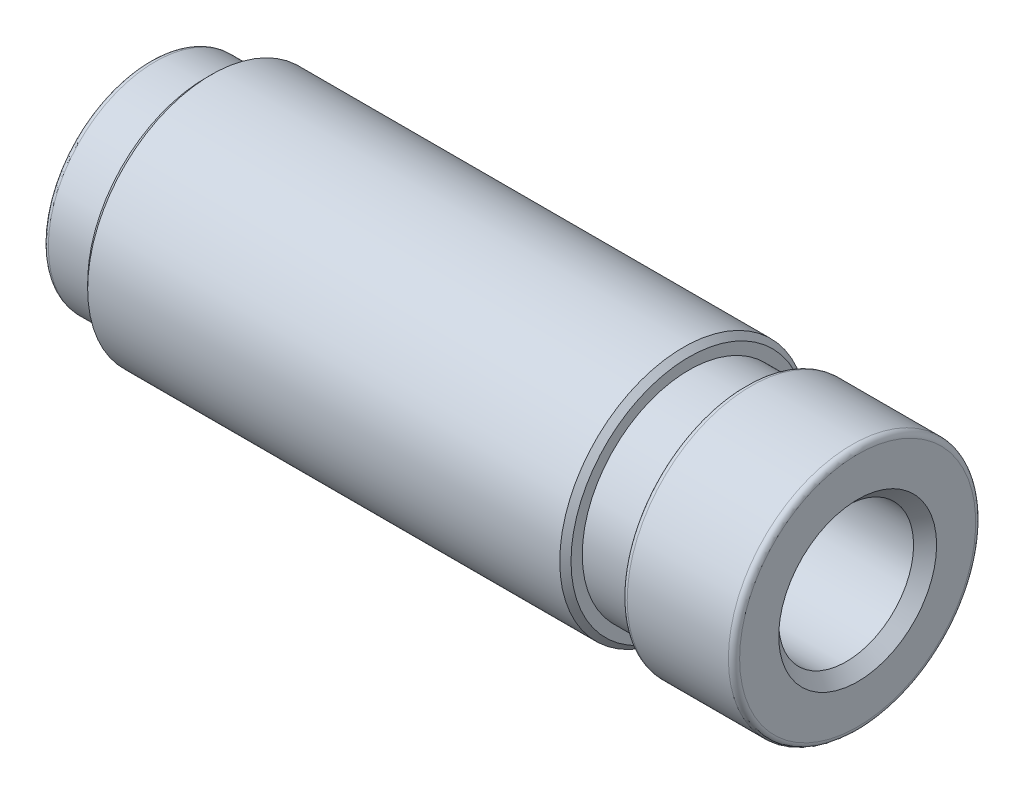
ISO-10303-21;
HEADER;
FILE_DESCRIPTION(('STEP AP214'),'2;1');
FILE_NAME('part.step','',(''),(''),'','','');
FILE_SCHEMA(('AUTOMOTIVE_DESIGN { 1 0 10303 214 1 1 1 1 }'));
ENDSEC;
DATA;
#1=APPLICATION_CONTEXT('core data for automotive mechanical design processes');
#2=APPLICATION_PROTOCOL_DEFINITION('international standard','automotive_design',2000,#1);
#3=PRODUCT_CONTEXT('',#1,'mechanical');
#4=PRODUCT('Part','Part','',(#3));
#5=PRODUCT_RELATED_PRODUCT_CATEGORY('part','',(#4));
#6=PRODUCT_DEFINITION_FORMATION('','',#4);
#7=PRODUCT_DEFINITION_CONTEXT('part definition',#1,'design');
#8=PRODUCT_DEFINITION('design','',#6,#7);
#9=PRODUCT_DEFINITION_SHAPE('','',#8);
#10=(LENGTH_UNIT() NAMED_UNIT(*) SI_UNIT(.MILLI.,.METRE.));
#11=(NAMED_UNIT(*) PLANE_ANGLE_UNIT() SI_UNIT($,.RADIAN.));
#12=(NAMED_UNIT(*) SI_UNIT($,.STERADIAN.) SOLID_ANGLE_UNIT());
#13=UNCERTAINTY_MEASURE_WITH_UNIT(LENGTH_MEASURE(1.E-05),#10,'distance_accuracy_value','');
#14=(GEOMETRIC_REPRESENTATION_CONTEXT(3) GLOBAL_UNCERTAINTY_ASSIGNED_CONTEXT((#13)) GLOBAL_UNIT_ASSIGNED_CONTEXT((#10,
#11,#12)) REPRESENTATION_CONTEXT('',''));
#15=CARTESIAN_POINT('',(0.,0.,0.));
#16=DIRECTION('',(0.,0.,1.));
#17=DIRECTION('',(1.,0.,0.));
#18=AXIS2_PLACEMENT_3D('',#15,#16,#17);
#19=CARTESIAN_POINT('',(0.,9.50000000000001,0.));
#20=DIRECTION('',(1.,0.,0.));
#21=DIRECTION('',(0.,0.,-1.));
#22=AXIS2_PLACEMENT_3D('',#19,#20,#21);
#23=PLANE('',#22);
#24=CARTESIAN_POINT('',(0.,0.,0.));
#25=DIRECTION('',(1.,0.,0.));
#26=DIRECTION('',(0.,0.,-1.));
#27=AXIS2_PLACEMENT_3D('',#24,#25,#26);
#28=CIRCLE('',#27,6.34000000000001);
#29=CARTESIAN_POINT('',(0.,0.,-6.34000000000001));
#30=VERTEX_POINT('',#29);
#31=EDGE_CURVE('E57',#30,#30,#28,.T.);
#32=ORIENTED_EDGE('',*,*,#31,.T.);
#33=EDGE_LOOP('',(#32));
#34=FACE_BOUND('',#33,.T.);
#35=CARTESIAN_POINT('',(0.,0.,0.));
#36=DIRECTION('',(1.,0.,0.));
#37=DIRECTION('',(0.,0.,-1.));
#38=AXIS2_PLACEMENT_3D('',#35,#36,#37);
#39=CIRCLE('',#38,9.00000000000001);
#40=CARTESIAN_POINT('',(0.,0.,-9.00000000000001));
#41=VERTEX_POINT('',#40);
#42=EDGE_CURVE('E66',#41,#41,#39,.F.);
#43=ORIENTED_EDGE('',*,*,#42,.T.);
#44=EDGE_LOOP('',(#43));
#45=FACE_BOUND('',#44,.T.);
#46=ADVANCED_FACE('F37',(#34,#45),#23,.F.);
#47=CARTESIAN_POINT('',(63.,0.,0.));
#48=DIRECTION('',(-1.,0.,0.));
#49=DIRECTION('',(0.,0.,1.));
#50=AXIS2_PLACEMENT_3D('',#47,#48,#49);
#51=PLANE('',#50);
#52=CARTESIAN_POINT('',(63.,0.,0.));
#53=DIRECTION('',(-1.,0.,0.));
#54=DIRECTION('',(0.,0.,1.));
#55=AXIS2_PLACEMENT_3D('',#52,#53,#54);
#56=CIRCLE('',#55,10.5);
#57=CARTESIAN_POINT('',(63.,0.,10.5));
#58=VERTEX_POINT('',#57);
#59=EDGE_CURVE('E72',#58,#58,#56,.F.);
#60=ORIENTED_EDGE('',*,*,#59,.T.);
#61=EDGE_LOOP('',(#60));
#62=FACE_BOUND('',#61,.T.);
#63=CARTESIAN_POINT('',(63.,0.,0.));
#64=DIRECTION('',(1.,0.,0.));
#65=DIRECTION('',(0.,0.,-1.));
#66=AXIS2_PLACEMENT_3D('',#63,#64,#65);
#67=CIRCLE('',#66,7.025);
#68=CARTESIAN_POINT('',(63.,0.,-7.025));
#69=VERTEX_POINT('',#68);
#70=EDGE_CURVE('E85',#69,#69,#67,.T.);
#71=ORIENTED_EDGE('',*,*,#70,.F.);
#72=EDGE_LOOP('',(#71));
#73=FACE_BOUND('',#72,.T.);
#74=ADVANCED_FACE('F105',(#62,#73),#51,.F.);
#75=CARTESIAN_POINT('',(0.,0.,0.));
#76=DIRECTION('',(-1.,0.,0.));
#77=DIRECTION('',(0.,0.,1.));
#78=AXIS2_PLACEMENT_3D('',#75,#76,#77);
#79=CYLINDRICAL_SURFACE('',#78,11.);
#80=CARTESIAN_POINT('',(62.5,0.,0.));
#81=DIRECTION('',(-1.,0.,0.));
#82=DIRECTION('',(0.,0.,1.));
#83=AXIS2_PLACEMENT_3D('',#80,#81,#82);
#84=CIRCLE('',#83,11.);
#85=CARTESIAN_POINT('',(62.5,0.,11.));
#86=VERTEX_POINT('',#85);
#87=EDGE_CURVE('E75',#86,#86,#84,.T.);
#88=ORIENTED_EDGE('',*,*,#87,.T.);
#89=EDGE_LOOP('',(#88));
#90=FACE_BOUND('',#89,.T.);
#91=CARTESIAN_POINT('',(53.5,0.,0.));
#92=DIRECTION('',(1.,0.,0.));
#93=DIRECTION('',(0.,0.,-1.));
#94=AXIS2_PLACEMENT_3D('',#91,#92,#93);
#95=CIRCLE('',#94,11.);
#96=CARTESIAN_POINT('',(53.5,0.,-11.));
#97=VERTEX_POINT('',#96);
#98=EDGE_CURVE('E78',#97,#97,#95,.T.);
#99=ORIENTED_EDGE('',*,*,#98,.T.);
#100=EDGE_LOOP('',(#99));
#101=FACE_BOUND('',#100,.T.);
#102=ADVANCED_FACE('F107',(#90,#101),#79,.T.);
#103=CARTESIAN_POINT('',(53.,11.,0.));
#104=DIRECTION('',(1.,0.,0.));
#105=DIRECTION('',(0.,0.,-1.));
#106=AXIS2_PLACEMENT_3D('',#103,#104,#105);
#107=PLANE('',#106);
#108=CARTESIAN_POINT('',(53.,0.,0.));
#109=DIRECTION('',(1.,0.,0.));
#110=DIRECTION('',(0.,0.,-1.));
#111=AXIS2_PLACEMENT_3D('',#108,#109,#110);
#112=CIRCLE('',#111,10.5);
#113=CARTESIAN_POINT('',(53.,0.,-10.5));
#114=VERTEX_POINT('',#113);
#115=EDGE_CURVE('E69',#114,#114,#112,.F.);
#116=ORIENTED_EDGE('',*,*,#115,.T.);
#117=EDGE_LOOP('',(#116));
#118=FACE_BOUND('',#117,.T.);
#119=CARTESIAN_POINT('',(53.,0.,0.));
#120=DIRECTION('',(-1.,0.,0.));
#121=DIRECTION('',(0.,0.,1.));
#122=AXIS2_PLACEMENT_3D('',#119,#120,#121);
#123=CIRCLE('',#122,9.5);
#124=CARTESIAN_POINT('',(53.,0.,9.5));
#125=VERTEX_POINT('',#124);
#126=EDGE_CURVE('E81',#125,#125,#123,.T.);
#127=ORIENTED_EDGE('',*,*,#126,.F.);
#128=EDGE_LOOP('',(#127));
#129=FACE_BOUND('',#128,.T.);
#130=ADVANCED_FACE('F114',(#118,#129),#107,.F.);
#131=CARTESIAN_POINT('',(0.,0.,0.));
#132=DIRECTION('',(-1.,0.,0.));
#133=DIRECTION('',(0.,0.,1.));
#134=AXIS2_PLACEMENT_3D('',#131,#132,#133);
#135=CYLINDRICAL_SURFACE('',#134,9.5);
#136=CARTESIAN_POINT('',(48.,0.,0.));
#137=DIRECTION('',(-1.,0.,0.));
#138=DIRECTION('',(0.,0.,1.));
#139=AXIS2_PLACEMENT_3D('',#136,#137,#138);
#140=CIRCLE('',#139,9.5);
#141=CARTESIAN_POINT('',(48.,0.,9.5));
#142=VERTEX_POINT('',#141);
#143=EDGE_CURVE('E88',#142,#142,#140,.T.);
#144=ORIENTED_EDGE('',*,*,#143,.F.);
#145=EDGE_LOOP('',(#144));
#146=FACE_BOUND('',#145,.T.);
#147=ORIENTED_EDGE('',*,*,#126,.T.);
#148=EDGE_LOOP('',(#147));
#149=FACE_BOUND('',#148,.T.);
#150=ADVANCED_FACE('F161',(#146,#149),#135,.T.);
#151=CARTESIAN_POINT('',(48.,9.5,0.));
#152=DIRECTION('',(-1.,0.,0.));
#153=DIRECTION('',(0.,0.,1.));
#154=AXIS2_PLACEMENT_3D('',#151,#152,#153);
#155=PLANE('',#154);
#156=CARTESIAN_POINT('',(48.,0.,0.));
#157=DIRECTION('',(-1.,0.,0.));
#158=DIRECTION('',(0.,0.,1.));
#159=AXIS2_PLACEMENT_3D('',#156,#157,#158);
#160=CIRCLE('',#159,10.5);
#161=CARTESIAN_POINT('',(48.,0.,10.5));
#162=VERTEX_POINT('',#161);
#163=EDGE_CURVE('E44',#162,#162,#160,.F.);
#164=ORIENTED_EDGE('',*,*,#163,.T.);
#165=EDGE_LOOP('',(#164));
#166=FACE_BOUND('',#165,.T.);
#167=ORIENTED_EDGE('',*,*,#143,.T.);
#168=EDGE_LOOP('',(#167));
#169=FACE_BOUND('',#168,.T.);
#170=ADVANCED_FACE('F151',(#166,#169),#155,.F.);
#171=CARTESIAN_POINT('',(0.,0.,0.));
#172=DIRECTION('',(-1.,0.,0.));
#173=DIRECTION('',(0.,0.,1.));
#174=AXIS2_PLACEMENT_3D('',#171,#172,#173);
#175=CYLINDRICAL_SURFACE('',#174,11.);
#176=CARTESIAN_POINT('',(47.5,0.,0.));
#177=DIRECTION('',(-1.,0.,0.));
#178=DIRECTION('',(0.,0.,1.));
#179=AXIS2_PLACEMENT_3D('',#176,#177,#178);
#180=CIRCLE('',#179,11.);
#181=CARTESIAN_POINT('',(47.5,0.,11.));
#182=VERTEX_POINT('',#181);
#183=EDGE_CURVE('E48',#182,#182,#180,.T.);
#184=ORIENTED_EDGE('',*,*,#183,.T.);
#185=EDGE_LOOP('',(#184));
#186=FACE_BOUND('',#185,.T.);
#187=CARTESIAN_POINT('',(5.50000000000014,0.,0.));
#188=DIRECTION('',(1.,0.,0.));
#189=DIRECTION('',(0.,0.,-1.));
#190=AXIS2_PLACEMENT_3D('',#187,#188,#189);
#191=CIRCLE('',#190,11.);
#192=CARTESIAN_POINT('',(5.50000000000014,0.,-11.));
#193=VERTEX_POINT('',#192);
#194=EDGE_CURVE('E52',#193,#193,#191,.T.);
#195=ORIENTED_EDGE('',*,*,#194,.T.);
#196=EDGE_LOOP('',(#195));
#197=FACE_BOUND('',#196,.T.);
#198=ADVANCED_FACE('F147',(#186,#197),#175,.T.);
#199=CARTESIAN_POINT('',(5.00000000000007,11.,0.));
#200=DIRECTION('',(1.,0.,0.));
#201=DIRECTION('',(0.,0.,-1.));
#202=AXIS2_PLACEMENT_3D('',#199,#200,#201);
#203=PLANE('',#202);
#204=CARTESIAN_POINT('',(5.00000000000007,0.,0.));
#205=DIRECTION('',(1.,0.,0.));
#206=DIRECTION('',(0.,0.,-1.));
#207=AXIS2_PLACEMENT_3D('',#204,#205,#206);
#208=CIRCLE('',#207,10.4999999999999);
#209=CARTESIAN_POINT('',(5.00000000000007,0.,-10.4999999999999));
#210=VERTEX_POINT('',#209);
#211=EDGE_CURVE('E10',#210,#210,#208,.F.);
#212=ORIENTED_EDGE('',*,*,#211,.T.);
#213=EDGE_LOOP('',(#212));
#214=FACE_BOUND('',#213,.T.);
#215=CARTESIAN_POINT('',(5.,0.,0.));
#216=DIRECTION('',(-1.,0.,0.));
#217=DIRECTION('',(0.,0.,1.));
#218=AXIS2_PLACEMENT_3D('',#215,#216,#217);
#219=CIRCLE('',#218,9.50000000000001);
#220=CARTESIAN_POINT('',(5.,0.,9.50000000000001));
#221=VERTEX_POINT('',#220);
#222=EDGE_CURVE('E91',#221,#221,#219,.T.);
#223=ORIENTED_EDGE('',*,*,#222,.F.);
#224=EDGE_LOOP('',(#223));
#225=FACE_BOUND('',#224,.T.);
#226=ADVANCED_FACE('F150',(#214,#225),#203,.F.);
#227=CARTESIAN_POINT('',(0.,0.,0.));
#228=DIRECTION('',(-1.,0.,0.));
#229=DIRECTION('',(0.,0.,1.));
#230=AXIS2_PLACEMENT_3D('',#227,#228,#229);
#231=CYLINDRICAL_SURFACE('',#230,9.50000000000001);
#232=CARTESIAN_POINT('',(0.5,0.,0.));
#233=DIRECTION('',(1.,0.,0.));
#234=DIRECTION('',(0.,0.,-1.));
#235=AXIS2_PLACEMENT_3D('',#232,#233,#234);
#236=CIRCLE('',#235,9.50000000000001);
#237=CARTESIAN_POINT('',(0.5,0.,-9.50000000000001));
#238=VERTEX_POINT('',#237);
#239=EDGE_CURVE('E63',#238,#238,#236,.T.);
#240=ORIENTED_EDGE('',*,*,#239,.T.);
#241=EDGE_LOOP('',(#240));
#242=FACE_BOUND('',#241,.T.);
#243=ORIENTED_EDGE('',*,*,#222,.T.);
#244=EDGE_LOOP('',(#243));
#245=FACE_BOUND('',#244,.T.);
#246=ADVANCED_FACE('F159',(#242,#245),#231,.T.);
#247=CARTESIAN_POINT('',(13.,0.,0.));
#248=DIRECTION('',(1.,0.,0.));
#249=DIRECTION('',(0.,0.,-1.));
#250=AXIS2_PLACEMENT_3D('',#247,#248,#249);
#251=CONICAL_SURFACE('',#250,5.99999999999999,1.02974425867665);
#252=CARTESIAN_POINT('',(12.303001681928,0.,0.));
#253=DIRECTION('',(1.,0.,0.));
#254=DIRECTION('',(0.,0.,-1.));
#255=AXIS2_PLACEMENT_3D('',#252,#253,#254);
#256=CIRCLE('',#255,4.84000000000001);
#257=CARTESIAN_POINT('',(12.303001681928,0.,-4.84000000000001));
#258=VERTEX_POINT('',#257);
#259=EDGE_CURVE('E82',#258,#258,#256,.F.);
#260=ORIENTED_EDGE('',*,*,#259,.T.);
#261=EDGE_LOOP('',(#260));
#262=FACE_BOUND('',#261,.T.);
#263=CARTESIAN_POINT('',(13.,0.,0.));
#264=DIRECTION('',(1.,0.,0.));
#265=DIRECTION('',(0.,0.,-1.));
#266=AXIS2_PLACEMENT_3D('',#263,#264,#265);
#267=CIRCLE('',#266,5.99999999999999);
#268=CARTESIAN_POINT('',(13.,0.,-5.99999999999999));
#269=VERTEX_POINT('',#268);
#270=EDGE_CURVE('E94',#269,#269,#267,.T.);
#271=ORIENTED_EDGE('',*,*,#270,.T.);
#272=EDGE_LOOP('',(#271));
#273=FACE_BOUND('',#272,.T.);
#274=ADVANCED_FACE('F264',(#262,#273),#251,.F.);
#275=CARTESIAN_POINT('',(63.,0.,0.));
#276=DIRECTION('',(1.,0.,0.));
#277=DIRECTION('',(0.,0.,-1.));
#278=AXIS2_PLACEMENT_3D('',#275,#276,#277);
#279=CYLINDRICAL_SURFACE('',#278,5.99999999999999);
#280=ORIENTED_EDGE('',*,*,#270,.F.);
#281=EDGE_LOOP('',(#280));
#282=FACE_BOUND('',#281,.T.);
#283=CARTESIAN_POINT('',(61.975,0.,0.));
#284=DIRECTION('',(1.,0.,0.));
#285=DIRECTION('',(0.,0.,-1.));
#286=AXIS2_PLACEMENT_3D('',#283,#284,#285);
#287=CIRCLE('',#286,6.);
#288=CARTESIAN_POINT('',(61.975,0.,-6.));
#289=VERTEX_POINT('',#288);
#290=EDGE_CURVE('E97',#289,#289,#287,.T.);
#291=ORIENTED_EDGE('',*,*,#290,.T.);
#292=EDGE_LOOP('',(#291));
#293=FACE_BOUND('',#292,.T.);
#294=ADVANCED_FACE('F254',(#282,#293),#279,.F.);
#295=CARTESIAN_POINT('',(63.,0.,0.));
#296=DIRECTION('',(1.,0.,0.));
#297=DIRECTION('',(0.,0.,-1.));
#298=AXIS2_PLACEMENT_3D('',#295,#296,#297);
#299=CONICAL_SURFACE('',#298,7.025,0.785398163397451);
#300=ORIENTED_EDGE('',*,*,#290,.F.);
#301=EDGE_LOOP('',(#300));
#302=FACE_BOUND('',#301,.T.);
#303=ORIENTED_EDGE('',*,*,#70,.T.);
#304=EDGE_LOOP('',(#303));
#305=FACE_BOUND('',#304,.T.);
#306=ADVANCED_FACE('F103',(#302,#305),#299,.F.);
#307=CARTESIAN_POINT('',(0.,0.,0.));
#308=DIRECTION('',(-1.,0.,0.));
#309=DIRECTION('',(0.,0.,1.));
#310=AXIS2_PLACEMENT_3D('',#307,#308,#309);
#311=CYLINDRICAL_SURFACE('',#310,4.84000000000001);
#312=CARTESIAN_POINT('',(1.5,0.,0.));
#313=DIRECTION('',(1.,0.,0.));
#314=DIRECTION('',(0.,0.,-1.));
#315=AXIS2_PLACEMENT_3D('',#312,#313,#314);
#316=CIRCLE('',#315,4.84000000000001);
#317=CARTESIAN_POINT('',(1.5,0.,-4.84000000000001));
#318=VERTEX_POINT('',#317);
#319=EDGE_CURVE('E60',#318,#318,#316,.F.);
#320=ORIENTED_EDGE('',*,*,#319,.T.);
#321=EDGE_LOOP('',(#320));
#322=FACE_BOUND('',#321,.T.);
#323=ORIENTED_EDGE('',*,*,#259,.F.);
#324=EDGE_LOOP('',(#323));
#325=FACE_BOUND('',#324,.T.);
#326=ADVANCED_FACE('F125',(#322,#325),#311,.F.);
#327=CARTESIAN_POINT('',(62.5,0.,0.));
#328=DIRECTION('',(-1.,0.,0.));
#329=DIRECTION('',(0.,0.,1.));
#330=AXIS2_PLACEMENT_3D('',#327,#328,#329);
#331=TOROIDAL_SURFACE('',#330,10.5,0.5);
#332=ORIENTED_EDGE('',*,*,#59,.F.);
#333=EDGE_LOOP('',(#332));
#334=FACE_BOUND('',#333,.T.);
#335=ORIENTED_EDGE('',*,*,#87,.F.);
#336=EDGE_LOOP('',(#335));
#337=FACE_BOUND('',#336,.T.);
#338=ADVANCED_FACE('F121',(#334,#337),#331,.T.);
#339=CARTESIAN_POINT('',(53.5,0.,0.));
#340=DIRECTION('',(1.,0.,0.));
#341=DIRECTION('',(0.,0.,-1.));
#342=AXIS2_PLACEMENT_3D('',#339,#340,#341);
#343=TOROIDAL_SURFACE('',#342,10.5,0.5);
#344=ORIENTED_EDGE('',*,*,#98,.F.);
#345=EDGE_LOOP('',(#344));
#346=FACE_BOUND('',#345,.T.);
#347=ORIENTED_EDGE('',*,*,#115,.F.);
#348=EDGE_LOOP('',(#347));
#349=FACE_BOUND('',#348,.T.);
#350=ADVANCED_FACE('F124',(#346,#349),#343,.T.);
#351=CARTESIAN_POINT('',(0.5,0.,0.));
#352=DIRECTION('',(1.,0.,0.));
#353=DIRECTION('',(0.,0.,-1.));
#354=AXIS2_PLACEMENT_3D('',#351,#352,#353);
#355=TOROIDAL_SURFACE('',#354,9.00000000000001,0.5);
#356=ORIENTED_EDGE('',*,*,#239,.F.);
#357=EDGE_LOOP('',(#356));
#358=FACE_BOUND('',#357,.T.);
#359=ORIENTED_EDGE('',*,*,#42,.F.);
#360=EDGE_LOOP('',(#359));
#361=FACE_BOUND('',#360,.T.);
#362=ADVANCED_FACE('F129',(#358,#361),#355,.T.);
#363=CARTESIAN_POINT('',(1.5,0.,0.));
#364=DIRECTION('',(1.,0.,0.));
#365=DIRECTION('',(0.,0.,-1.));
#366=AXIS2_PLACEMENT_3D('',#363,#364,#365);
#367=TOROIDAL_SURFACE('',#366,6.34000000000001,1.5);
#368=ORIENTED_EDGE('',*,*,#31,.F.);
#369=EDGE_LOOP('',(#368));
#370=FACE_BOUND('',#369,.T.);
#371=ORIENTED_EDGE('',*,*,#319,.F.);
#372=EDGE_LOOP('',(#371));
#373=FACE_BOUND('',#372,.T.);
#374=ADVANCED_FACE('F133',(#370,#373),#367,.T.);
#375=CARTESIAN_POINT('',(47.5,0.,0.));
#376=DIRECTION('',(-1.,0.,0.));
#377=DIRECTION('',(0.,0.,1.));
#378=AXIS2_PLACEMENT_3D('',#375,#376,#377);
#379=CONICAL_SURFACE('',#378,11.,0.785398163397436);
#380=ORIENTED_EDGE('',*,*,#163,.F.);
#381=EDGE_LOOP('',(#380));
#382=FACE_BOUND('',#381,.T.);
#383=ORIENTED_EDGE('',*,*,#183,.F.);
#384=EDGE_LOOP('',(#383));
#385=FACE_BOUND('',#384,.T.);
#386=ADVANCED_FACE('F136',(#382,#385),#379,.T.);
#387=CARTESIAN_POINT('',(5.00000000000007,0.,0.));
#388=DIRECTION('',(1.,0.,0.));
#389=DIRECTION('',(0.,0.,-1.));
#390=AXIS2_PLACEMENT_3D('',#387,#388,#389);
#391=CONICAL_SURFACE('',#390,10.4999999999999,0.785398163397445);
#392=ORIENTED_EDGE('',*,*,#194,.F.);
#393=EDGE_LOOP('',(#392));
#394=FACE_BOUND('',#393,.T.);
#395=ORIENTED_EDGE('',*,*,#211,.F.);
#396=EDGE_LOOP('',(#395));
#397=FACE_BOUND('',#396,.T.);
#398=ADVANCED_FACE('F39',(#394,#397),#391,.T.);
#399=CLOSED_SHELL('',(#46,#74,#102,#130,#150,#170,#198,#226,#246,#274,#294,#306,#326,#338,#350,
#362,#374,#386,#398));
#400=MANIFOLD_SOLID_BREP('B2',#399);
#401=ADVANCED_BREP_SHAPE_REPRESENTATION('',(#18,#400),#14);
#402=SHAPE_DEFINITION_REPRESENTATION(#9,#401);
ENDSEC;
END-ISO-10303-21;
